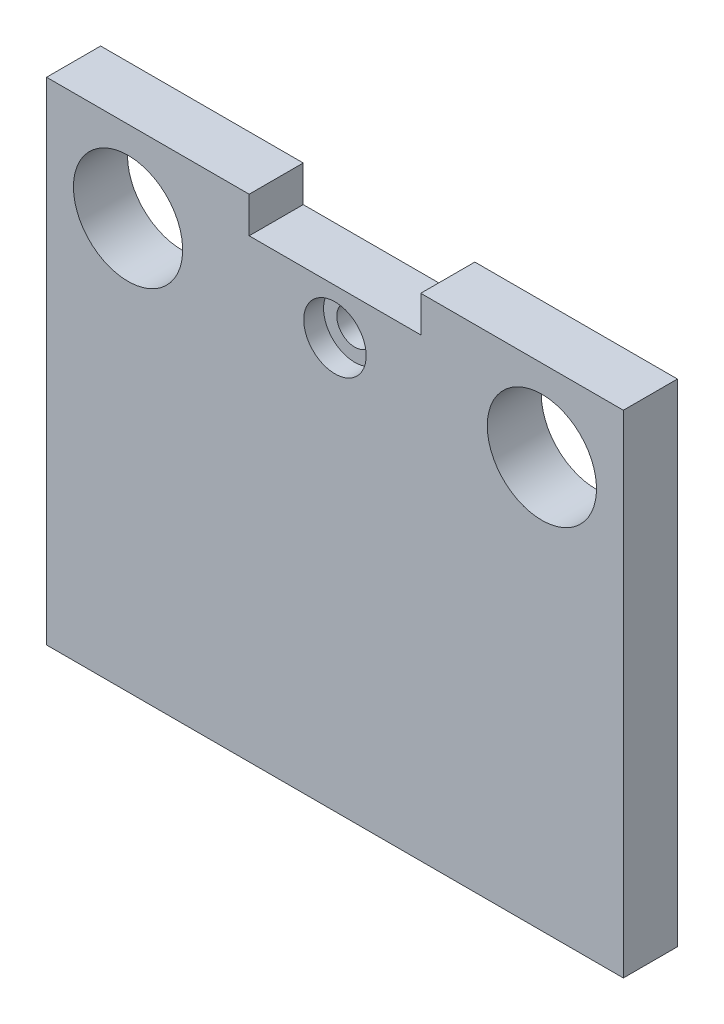
ISO-10303-21;
HEADER;
FILE_DESCRIPTION(('STEP AP214'),'2;1');
FILE_NAME('part.step','',(''),(''),'','','');
FILE_SCHEMA(('AUTOMOTIVE_DESIGN { 1 0 10303 214 1 1 1 1 }'));
ENDSEC;
DATA;
#1=APPLICATION_CONTEXT('core data for automotive mechanical design processes');
#2=APPLICATION_PROTOCOL_DEFINITION('international standard','automotive_design',2000,#1);
#3=PRODUCT_CONTEXT('',#1,'mechanical');
#4=PRODUCT('Part','Part','',(#3));
#5=PRODUCT_RELATED_PRODUCT_CATEGORY('part','',(#4));
#6=PRODUCT_DEFINITION_FORMATION('','',#4);
#7=PRODUCT_DEFINITION_CONTEXT('part definition',#1,'design');
#8=PRODUCT_DEFINITION('design','',#6,#7);
#9=PRODUCT_DEFINITION_SHAPE('','',#8);
#10=(LENGTH_UNIT() NAMED_UNIT(*) SI_UNIT(.MILLI.,.METRE.));
#11=(NAMED_UNIT(*) PLANE_ANGLE_UNIT() SI_UNIT($,.RADIAN.));
#12=(NAMED_UNIT(*) SI_UNIT($,.STERADIAN.) SOLID_ANGLE_UNIT());
#13=UNCERTAINTY_MEASURE_WITH_UNIT(LENGTH_MEASURE(1.E-05),#10,'distance_accuracy_value','');
#14=(GEOMETRIC_REPRESENTATION_CONTEXT(3) GLOBAL_UNCERTAINTY_ASSIGNED_CONTEXT((#13)) GLOBAL_UNIT_ASSIGNED_CONTEXT((#10,
#11,#12)) REPRESENTATION_CONTEXT('',''));
#15=CARTESIAN_POINT('',(0.,0.,0.));
#16=DIRECTION('',(0.,0.,1.));
#17=DIRECTION('',(1.,0.,0.));
#18=AXIS2_PLACEMENT_3D('',#15,#16,#17);
#19=CARTESIAN_POINT('',(203.2,173.228,19.05));
#20=DIRECTION('',(0.,-1.,0.));
#21=DIRECTION('',(0.,0.,-1.));
#22=AXIS2_PLACEMENT_3D('',#19,#20,#21);
#23=PLANE('',#22);
#24=DIRECTION('',(-1.,0.,0.));
#25=VECTOR('',#24,1.);
#26=CARTESIAN_POINT('',(203.2,173.228,0.));
#27=LINE('',#26,#25);
#28=CARTESIAN_POINT('',(203.2,173.228,0.));
#29=VERTEX_POINT('',#28);
#30=CARTESIAN_POINT('',(131.826,173.228,0.));
#31=VERTEX_POINT('',#30);
#32=EDGE_CURVE('E162',#29,#31,#27,.T.);
#33=ORIENTED_EDGE('',*,*,#32,.T.);
#34=DIRECTION('',(0.,0.,-1.));
#35=VECTOR('',#34,1.);
#36=CARTESIAN_POINT('',(131.826,173.228,19.05));
#37=LINE('',#36,#35);
#38=CARTESIAN_POINT('',(131.826,173.228,19.05));
#39=VERTEX_POINT('',#38);
#40=EDGE_CURVE('E130',#39,#31,#37,.T.);
#41=ORIENTED_EDGE('',*,*,#40,.F.);
#42=DIRECTION('',(-1.,0.,0.));
#43=VECTOR('',#42,1.);
#44=CARTESIAN_POINT('',(203.2,173.228,19.05));
#45=LINE('',#44,#43);
#46=CARTESIAN_POINT('',(203.2,173.228,19.05));
#47=VERTEX_POINT('',#46);
#48=EDGE_CURVE('E122',#47,#39,#45,.T.);
#49=ORIENTED_EDGE('',*,*,#48,.F.);
#50=DIRECTION('',(0.,0.,-1.));
#51=VECTOR('',#50,1.);
#52=CARTESIAN_POINT('',(203.2,173.228,19.05));
#53=LINE('',#52,#51);
#54=EDGE_CURVE('E55',#47,#29,#53,.T.);
#55=ORIENTED_EDGE('',*,*,#54,.T.);
#56=EDGE_LOOP('',(#33,#41,#49,#55));
#57=FACE_BOUND('',#56,.T.);
#58=ADVANCED_FACE('F32',(#57),#23,.F.);
#59=CARTESIAN_POINT('',(0.,0.,19.05));
#60=DIRECTION('',(1.,0.,0.));
#61=DIRECTION('',(0.,0.,-1.));
#62=AXIS2_PLACEMENT_3D('',#59,#60,#61);
#63=PLANE('',#62);
#64=DIRECTION('',(0.,-1.,0.));
#65=VECTOR('',#64,1.);
#66=CARTESIAN_POINT('',(0.,0.,19.05));
#67=LINE('',#66,#65);
#68=CARTESIAN_POINT('',(0.,173.228,19.05));
#69=VERTEX_POINT('',#68);
#70=CARTESIAN_POINT('',(0.,0.,19.05));
#71=VERTEX_POINT('',#70);
#72=EDGE_CURVE('E169',#69,#71,#67,.T.);
#73=ORIENTED_EDGE('',*,*,#72,.F.);
#74=DIRECTION('',(0.,0.,-1.));
#75=VECTOR('',#74,1.);
#76=CARTESIAN_POINT('',(0.,173.228,19.05));
#77=LINE('',#76,#75);
#78=CARTESIAN_POINT('',(0.,173.228,0.));
#79=VERTEX_POINT('',#78);
#80=EDGE_CURVE('E164',#69,#79,#77,.T.);
#81=ORIENTED_EDGE('',*,*,#80,.T.);
#82=DIRECTION('',(0.,-1.,0.));
#83=VECTOR('',#82,1.);
#84=CARTESIAN_POINT('',(0.,0.,0.));
#85=LINE('',#84,#83);
#86=CARTESIAN_POINT('',(0.,0.,0.));
#87=VERTEX_POINT('',#86);
#88=EDGE_CURVE('E167',#79,#87,#85,.T.);
#89=ORIENTED_EDGE('',*,*,#88,.T.);
#90=DIRECTION('',(0.,0.,-1.));
#91=VECTOR('',#90,1.);
#92=CARTESIAN_POINT('',(0.,0.,19.05));
#93=LINE('',#92,#91);
#94=EDGE_CURVE('E11',#71,#87,#93,.T.);
#95=ORIENTED_EDGE('',*,*,#94,.F.);
#96=EDGE_LOOP('',(#73,#81,#89,#95));
#97=FACE_BOUND('',#96,.T.);
#98=ADVANCED_FACE('F34',(#97),#63,.F.);
#99=CARTESIAN_POINT('',(0.,0.,19.05));
#100=DIRECTION('',(0.,1.,0.));
#101=DIRECTION('',(0.,0.,1.));
#102=AXIS2_PLACEMENT_3D('',#99,#100,#101);
#103=PLANE('',#102);
#104=DIRECTION('',(1.,0.,0.));
#105=VECTOR('',#104,1.);
#106=CARTESIAN_POINT('',(0.,0.,0.));
#107=LINE('',#106,#105);
#108=CARTESIAN_POINT('',(203.2,0.,0.));
#109=VERTEX_POINT('',#108);
#110=EDGE_CURVE('E177',#87,#109,#107,.T.);
#111=ORIENTED_EDGE('',*,*,#110,.T.);
#112=DIRECTION('',(0.,0.,-1.));
#113=VECTOR('',#112,1.);
#114=CARTESIAN_POINT('',(203.2,0.,19.05));
#115=LINE('',#114,#113);
#116=CARTESIAN_POINT('',(203.2,0.,19.05));
#117=VERTEX_POINT('',#116);
#118=EDGE_CURVE('E40',#117,#109,#115,.T.);
#119=ORIENTED_EDGE('',*,*,#118,.F.);
#120=DIRECTION('',(1.,0.,0.));
#121=VECTOR('',#120,1.);
#122=CARTESIAN_POINT('',(0.,0.,19.05));
#123=LINE('',#122,#121);
#124=EDGE_CURVE('E171',#71,#117,#123,.T.);
#125=ORIENTED_EDGE('',*,*,#124,.F.);
#126=ORIENTED_EDGE('',*,*,#94,.T.);
#127=EDGE_LOOP('',(#111,#119,#125,#126));
#128=FACE_BOUND('',#127,.T.);
#129=ADVANCED_FACE('F195',(#128),#103,.F.);
#130=CARTESIAN_POINT('',(203.2,0.,19.05));
#131=DIRECTION('',(-1.,0.,0.));
#132=DIRECTION('',(0.,0.,1.));
#133=AXIS2_PLACEMENT_3D('',#130,#131,#132);
#134=PLANE('',#133);
#135=DIRECTION('',(0.,1.,0.));
#136=VECTOR('',#135,1.);
#137=CARTESIAN_POINT('',(203.2,0.,0.));
#138=LINE('',#137,#136);
#139=EDGE_CURVE('E172',#109,#29,#138,.T.);
#140=ORIENTED_EDGE('',*,*,#139,.T.);
#141=ORIENTED_EDGE('',*,*,#54,.F.);
#142=DIRECTION('',(0.,1.,0.));
#143=VECTOR('',#142,1.);
#144=CARTESIAN_POINT('',(203.2,0.,19.05));
#145=LINE('',#144,#143);
#146=EDGE_CURVE('E174',#117,#47,#145,.T.);
#147=ORIENTED_EDGE('',*,*,#146,.F.);
#148=ORIENTED_EDGE('',*,*,#118,.T.);
#149=EDGE_LOOP('',(#140,#141,#147,#148));
#150=FACE_BOUND('',#149,.T.);
#151=ADVANCED_FACE('F185',(#150),#134,.F.);
#152=CARTESIAN_POINT('',(0.,304.8,19.05));
#153=DIRECTION('',(0.,0.,-1.));
#154=DIRECTION('',(-1.,0.,0.));
#155=AXIS2_PLACEMENT_3D('',#152,#153,#154);
#156=PLANE('',#155);
#157=ORIENTED_EDGE('',*,*,#48,.T.);
#158=DIRECTION('',(0.,-1.,0.));
#159=VECTOR('',#158,1.);
#160=CARTESIAN_POINT('',(131.826,173.228,19.05));
#161=LINE('',#160,#159);
#162=CARTESIAN_POINT('',(131.826,160.528,19.05));
#163=VERTEX_POINT('',#162);
#164=EDGE_CURVE('E101',#39,#163,#161,.T.);
#165=ORIENTED_EDGE('',*,*,#164,.T.);
#166=DIRECTION('',(-1.,0.,0.));
#167=VECTOR('',#166,1.);
#168=CARTESIAN_POINT('',(131.826,160.528,19.05));
#169=LINE('',#168,#167);
#170=CARTESIAN_POINT('',(71.374,160.528,19.05));
#171=VERTEX_POINT('',#170);
#172=EDGE_CURVE('E112',#163,#171,#169,.T.);
#173=ORIENTED_EDGE('',*,*,#172,.T.);
#174=DIRECTION('',(0.,1.,0.));
#175=VECTOR('',#174,1.);
#176=CARTESIAN_POINT('',(71.374,173.228,19.05));
#177=LINE('',#176,#175);
#178=CARTESIAN_POINT('',(71.374,173.228,19.05));
#179=VERTEX_POINT('',#178);
#180=EDGE_CURVE('E109',#171,#179,#177,.T.);
#181=ORIENTED_EDGE('',*,*,#180,.T.);
#182=EDGE_CURVE('E161',#179,#69,#45,.T.);
#183=ORIENTED_EDGE('',*,*,#182,.T.);
#184=ORIENTED_EDGE('',*,*,#72,.T.);
#185=ORIENTED_EDGE('',*,*,#124,.T.);
#186=ORIENTED_EDGE('',*,*,#146,.T.);
#187=EDGE_LOOP('',(#157,#165,#173,#181,#183,#184,#185,#186));
#188=FACE_BOUND('',#187,.T.);
#189=CARTESIAN_POINT('',(101.6,144.526,19.05));
#190=DIRECTION('',(0.,0.,1.));
#191=DIRECTION('',(1.,0.,0.));
#192=AXIS2_PLACEMENT_3D('',#189,#190,#191);
#193=CIRCLE('',#192,10.9982);
#194=CARTESIAN_POINT('',(112.5982,144.526,19.05));
#195=VERTEX_POINT('',#194);
#196=EDGE_CURVE('E139',#195,#195,#193,.T.);
#197=ORIENTED_EDGE('',*,*,#196,.F.);
#198=EDGE_LOOP('',(#197));
#199=FACE_BOUND('',#198,.T.);
#200=CARTESIAN_POINT('',(28.702,144.526,19.05));
#201=DIRECTION('',(0.,0.,-1.));
#202=DIRECTION('',(-1.,0.,0.));
#203=AXIS2_PLACEMENT_3D('',#200,#201,#202);
#204=CIRCLE('',#203,19.2405);
#205=CARTESIAN_POINT('',(9.4615,144.526,19.05));
#206=VERTEX_POINT('',#205);
#207=EDGE_CURVE('E148',#206,#206,#204,.T.);
#208=ORIENTED_EDGE('',*,*,#207,.T.);
#209=EDGE_LOOP('',(#208));
#210=FACE_BOUND('',#209,.T.);
#211=CARTESIAN_POINT('',(174.498,144.526,19.05));
#212=DIRECTION('',(0.,0.,-1.));
#213=DIRECTION('',(-1.,0.,0.));
#214=AXIS2_PLACEMENT_3D('',#211,#212,#213);
#215=CIRCLE('',#214,19.2405);
#216=CARTESIAN_POINT('',(155.2575,144.526,19.05));
#217=VERTEX_POINT('',#216);
#218=EDGE_CURVE('E154',#217,#217,#215,.T.);
#219=ORIENTED_EDGE('',*,*,#218,.T.);
#220=EDGE_LOOP('',(#219));
#221=FACE_BOUND('',#220,.T.);
#222=ADVANCED_FACE('F119',(#188,#199,#210,#221),#156,.F.);
#223=CARTESIAN_POINT('',(0.,304.8,0.));
#224=DIRECTION('',(0.,0.,-1.));
#225=DIRECTION('',(-1.,0.,0.));
#226=AXIS2_PLACEMENT_3D('',#223,#224,#225);
#227=PLANE('',#226);
#228=DIRECTION('',(0.,-1.,0.));
#229=VECTOR('',#228,1.);
#230=CARTESIAN_POINT('',(131.826,173.228,0.));
#231=LINE('',#230,#229);
#232=CARTESIAN_POINT('',(131.826,160.528,0.));
#233=VERTEX_POINT('',#232);
#234=EDGE_CURVE('E104',#31,#233,#231,.T.);
#235=ORIENTED_EDGE('',*,*,#234,.F.);
#236=ORIENTED_EDGE('',*,*,#32,.F.);
#237=ORIENTED_EDGE('',*,*,#139,.F.);
#238=ORIENTED_EDGE('',*,*,#110,.F.);
#239=ORIENTED_EDGE('',*,*,#88,.F.);
#240=CARTESIAN_POINT('',(71.374,173.228,0.));
#241=VERTEX_POINT('',#240);
#242=EDGE_CURVE('E157',#241,#79,#27,.T.);
#243=ORIENTED_EDGE('',*,*,#242,.F.);
#244=DIRECTION('',(0.,1.,0.));
#245=VECTOR('',#244,1.);
#246=CARTESIAN_POINT('',(71.374,173.228,0.));
#247=LINE('',#246,#245);
#248=CARTESIAN_POINT('',(71.374,160.528,0.));
#249=VERTEX_POINT('',#248);
#250=EDGE_CURVE('E47',#249,#241,#247,.T.);
#251=ORIENTED_EDGE('',*,*,#250,.F.);
#252=DIRECTION('',(-1.,0.,0.));
#253=VECTOR('',#252,1.);
#254=CARTESIAN_POINT('',(131.826,160.528,0.));
#255=LINE('',#254,#253);
#256=EDGE_CURVE('E124',#233,#249,#255,.T.);
#257=ORIENTED_EDGE('',*,*,#256,.F.);
#258=EDGE_LOOP('',(#235,#236,#237,#238,#239,#243,#251,#257));
#259=FACE_BOUND('',#258,.T.);
#260=CARTESIAN_POINT('',(101.6,144.526,0.));
#261=DIRECTION('',(0.,0.,1.));
#262=DIRECTION('',(1.,0.,0.));
#263=AXIS2_PLACEMENT_3D('',#260,#261,#262);
#264=CIRCLE('',#263,6.34999999999999);
#265=CARTESIAN_POINT('',(107.95,144.526,0.));
#266=VERTEX_POINT('',#265);
#267=EDGE_CURVE('E136',#266,#266,#264,.T.);
#268=ORIENTED_EDGE('',*,*,#267,.T.);
#269=EDGE_LOOP('',(#268));
#270=FACE_BOUND('',#269,.T.);
#271=CARTESIAN_POINT('',(28.702,144.526,0.));
#272=DIRECTION('',(0.,0.,-1.));
#273=DIRECTION('',(-1.,0.,0.));
#274=AXIS2_PLACEMENT_3D('',#271,#272,#273);
#275=CIRCLE('',#274,19.2405);
#276=CARTESIAN_POINT('',(9.4615,144.526,0.));
#277=VERTEX_POINT('',#276);
#278=EDGE_CURVE('E145',#277,#277,#275,.T.);
#279=ORIENTED_EDGE('',*,*,#278,.F.);
#280=EDGE_LOOP('',(#279));
#281=FACE_BOUND('',#280,.T.);
#282=CARTESIAN_POINT('',(174.498,144.526,0.));
#283=DIRECTION('',(0.,0.,-1.));
#284=DIRECTION('',(-1.,0.,0.));
#285=AXIS2_PLACEMENT_3D('',#282,#283,#284);
#286=CIRCLE('',#285,19.2405);
#287=CARTESIAN_POINT('',(155.2575,144.526,0.));
#288=VERTEX_POINT('',#287);
#289=EDGE_CURVE('E151',#288,#288,#286,.T.);
#290=ORIENTED_EDGE('',*,*,#289,.F.);
#291=EDGE_LOOP('',(#290));
#292=FACE_BOUND('',#291,.T.);
#293=ADVANCED_FACE('F190',(#259,#270,#281,#292),#227,.T.);
#294=ORIENTED_EDGE('',*,*,#182,.F.);
#295=DIRECTION('',(0.,0.,-1.));
#296=VECTOR('',#295,1.);
#297=CARTESIAN_POINT('',(71.374,173.228,19.05));
#298=LINE('',#297,#296);
#299=EDGE_CURVE('E133',#179,#241,#298,.T.);
#300=ORIENTED_EDGE('',*,*,#299,.T.);
#301=ORIENTED_EDGE('',*,*,#242,.T.);
#302=ORIENTED_EDGE('',*,*,#80,.F.);
#303=EDGE_LOOP('',(#294,#300,#301,#302));
#304=FACE_BOUND('',#303,.T.);
#305=ADVANCED_FACE('F201',(#304),#23,.F.);
#306=CARTESIAN_POINT('',(174.498,144.526,19.05));
#307=DIRECTION('',(0.,0.,-1.));
#308=DIRECTION('',(-1.,0.,0.));
#309=AXIS2_PLACEMENT_3D('',#306,#307,#308);
#310=CYLINDRICAL_SURFACE('',#309,19.2405);
#311=CARTESIAN_POINT('',(155.2575,144.526,19.05));
#312=CARTESIAN_POINT('',(155.2575,144.526,18.8515625));
#313=CARTESIAN_POINT('',(155.2575,144.526,18.653125));
#314=CARTESIAN_POINT('',(155.2575,144.526,18.25625));
#315=CARTESIAN_POINT('',(155.2575,144.526,18.0578125));
#316=CARTESIAN_POINT('',(155.2575,144.526,17.6609375));
#317=CARTESIAN_POINT('',(155.2575,144.526,17.4625));
#318=CARTESIAN_POINT('',(155.2575,144.526,17.065625));
#319=CARTESIAN_POINT('',(155.2575,144.526,16.8671875));
#320=CARTESIAN_POINT('',(155.2575,144.526,16.4703125));
#321=CARTESIAN_POINT('',(155.2575,144.526,16.271875));
#322=CARTESIAN_POINT('',(155.2575,144.526,15.875));
#323=CARTESIAN_POINT('',(155.2575,144.526,15.6765625));
#324=CARTESIAN_POINT('',(155.2575,144.526,15.2796875));
#325=CARTESIAN_POINT('',(155.2575,144.526,15.08125));
#326=CARTESIAN_POINT('',(155.2575,144.526,14.684375));
#327=CARTESIAN_POINT('',(155.2575,144.526,14.4859375));
#328=CARTESIAN_POINT('',(155.2575,144.526,14.0890625));
#329=CARTESIAN_POINT('',(155.2575,144.526,13.890625));
#330=CARTESIAN_POINT('',(155.2575,144.526,13.49375));
#331=CARTESIAN_POINT('',(155.2575,144.526,13.2953125));
#332=CARTESIAN_POINT('',(155.2575,144.526,12.8984375));
#333=CARTESIAN_POINT('',(155.2575,144.526,12.7));
#334=CARTESIAN_POINT('',(155.2575,144.526,12.303125));
#335=CARTESIAN_POINT('',(155.2575,144.526,12.1046875));
#336=CARTESIAN_POINT('',(155.2575,144.526,11.7078125));
#337=CARTESIAN_POINT('',(155.2575,144.526,11.509375));
#338=CARTESIAN_POINT('',(155.2575,144.526,11.1125));
#339=CARTESIAN_POINT('',(155.2575,144.526,10.9140625));
#340=CARTESIAN_POINT('',(155.2575,144.526,10.5171875));
#341=CARTESIAN_POINT('',(155.2575,144.526,10.31875));
#342=CARTESIAN_POINT('',(155.2575,144.526,9.921875));
#343=CARTESIAN_POINT('',(155.2575,144.526,9.7234375));
#344=CARTESIAN_POINT('',(155.2575,144.526,9.3265625));
#345=CARTESIAN_POINT('',(155.2575,144.526,9.128125));
#346=CARTESIAN_POINT('',(155.2575,144.526,8.73125));
#347=CARTESIAN_POINT('',(155.2575,144.526,8.5328125));
#348=CARTESIAN_POINT('',(155.2575,144.526,8.1359375));
#349=CARTESIAN_POINT('',(155.2575,144.526,7.9375));
#350=CARTESIAN_POINT('',(155.2575,144.526,7.540625));
#351=CARTESIAN_POINT('',(155.2575,144.526,7.3421875));
#352=CARTESIAN_POINT('',(155.2575,144.526,6.9453125));
#353=CARTESIAN_POINT('',(155.2575,144.526,6.746875));
#354=CARTESIAN_POINT('',(155.2575,144.526,6.35));
#355=CARTESIAN_POINT('',(155.2575,144.526,6.1515625));
#356=CARTESIAN_POINT('',(155.2575,144.526,5.7546875));
#357=CARTESIAN_POINT('',(155.2575,144.526,5.55625));
#358=CARTESIAN_POINT('',(155.2575,144.526,5.159375));
#359=CARTESIAN_POINT('',(155.2575,144.526,4.9609375));
#360=CARTESIAN_POINT('',(155.2575,144.526,4.5640625));
#361=CARTESIAN_POINT('',(155.2575,144.526,4.365625));
#362=CARTESIAN_POINT('',(155.2575,144.526,3.96875));
#363=CARTESIAN_POINT('',(155.2575,144.526,3.7703125));
#364=CARTESIAN_POINT('',(155.2575,144.526,3.3734375));
#365=CARTESIAN_POINT('',(155.2575,144.526,3.175));
#366=CARTESIAN_POINT('',(155.2575,144.526,2.778125));
#367=CARTESIAN_POINT('',(155.2575,144.526,2.5796875));
#368=CARTESIAN_POINT('',(155.2575,144.526,2.1828125));
#369=CARTESIAN_POINT('',(155.2575,144.526,1.984375));
#370=CARTESIAN_POINT('',(155.2575,144.526,1.5875));
#371=CARTESIAN_POINT('',(155.2575,144.526,1.3890625));
#372=CARTESIAN_POINT('',(155.2575,144.526,0.992187500000001));
#373=CARTESIAN_POINT('',(155.2575,144.526,0.793750000000001));
#374=CARTESIAN_POINT('',(155.2575,144.526,0.396875));
#375=CARTESIAN_POINT('',(155.2575,144.526,0.1984375));
#376=CARTESIAN_POINT('',(155.2575,144.526,0.));
#377=B_SPLINE_CURVE_WITH_KNOTS('',3,(#311,#312,#313,#314,#315,#316,#317,#318,#319,#320,#321,
#322,#323,#324,#325,#326,#327,#328,#329,#330,#331,#332,#333,#334,#335,#336,#337,#338,#339,#340,
#341,#342,#343,#344,#345,#346,#347,#348,#349,#350,#351,#352,#353,#354,#355,#356,#357,#358,#359,
#360,#361,#362,#363,#364,#365,#366,#367,#368,#369,#370,#371,#372,#373,#374,#375,#376),
.UNSPECIFIED.,.F.,.F.,(4,2,2,2,2,2,2,2,2,2,2,2,2,2,2,2,2,2,2,2,2,2,2,2,2,2,2,2,2,2,2,2,4),(0.,
0.595312499999997,1.190625,1.7859375,2.38125,2.9765625,3.571875,4.1671875,4.7625,5.3578125,
5.953125,6.5484375,7.14375,7.7390625,8.334375,8.9296875,9.525,10.1203125,10.715625,11.3109375,
11.90625,12.5015625,13.096875,13.6921875,14.2875,14.8828125,15.478125,16.0734375,16.66875,
17.2640625,17.859375,18.4546875,19.05),.UNSPECIFIED.);
#378=EDGE_CURVE('BSEAM220',#217,#288,#377,.T.);
#379=ORIENTED_EDGE('',*,*,#218,.F.);
#380=ORIENTED_EDGE('',*,*,#289,.T.);
#381=ORIENTED_EDGE('',*,*,#378,.T.);
#382=ORIENTED_EDGE('',*,*,#378,.F.);
#383=EDGE_LOOP('',(#379,#381,#380,#382));
#384=FACE_BOUND('',#383,.T.);
#385=ADVANCED_FACE('F220',(#384),#310,.F.);
#386=CARTESIAN_POINT('',(28.702,144.526,19.05));
#387=DIRECTION('',(0.,0.,-1.));
#388=DIRECTION('',(-1.,0.,0.));
#389=AXIS2_PLACEMENT_3D('',#386,#387,#388);
#390=CYLINDRICAL_SURFACE('',#389,19.2405);
#391=CARTESIAN_POINT('',(9.4615,144.526,19.05));
#392=CARTESIAN_POINT('',(9.4615,144.526,18.8515625));
#393=CARTESIAN_POINT('',(9.4615,144.526,18.653125));
#394=CARTESIAN_POINT('',(9.4615,144.526,18.25625));
#395=CARTESIAN_POINT('',(9.4615,144.526,18.0578125));
#396=CARTESIAN_POINT('',(9.4615,144.526,17.6609375));
#397=CARTESIAN_POINT('',(9.4615,144.526,17.4625));
#398=CARTESIAN_POINT('',(9.4615,144.526,17.065625));
#399=CARTESIAN_POINT('',(9.4615,144.526,16.8671875));
#400=CARTESIAN_POINT('',(9.4615,144.526,16.4703125));
#401=CARTESIAN_POINT('',(9.4615,144.526,16.271875));
#402=CARTESIAN_POINT('',(9.4615,144.526,15.875));
#403=CARTESIAN_POINT('',(9.4615,144.526,15.6765625));
#404=CARTESIAN_POINT('',(9.4615,144.526,15.2796875));
#405=CARTESIAN_POINT('',(9.4615,144.526,15.08125));
#406=CARTESIAN_POINT('',(9.4615,144.526,14.684375));
#407=CARTESIAN_POINT('',(9.4615,144.526,14.4859375));
#408=CARTESIAN_POINT('',(9.4615,144.526,14.0890625));
#409=CARTESIAN_POINT('',(9.4615,144.526,13.890625));
#410=CARTESIAN_POINT('',(9.4615,144.526,13.49375));
#411=CARTESIAN_POINT('',(9.4615,144.526,13.2953125));
#412=CARTESIAN_POINT('',(9.4615,144.526,12.8984375));
#413=CARTESIAN_POINT('',(9.4615,144.526,12.7));
#414=CARTESIAN_POINT('',(9.4615,144.526,12.303125));
#415=CARTESIAN_POINT('',(9.4615,144.526,12.1046875));
#416=CARTESIAN_POINT('',(9.4615,144.526,11.7078125));
#417=CARTESIAN_POINT('',(9.4615,144.526,11.509375));
#418=CARTESIAN_POINT('',(9.4615,144.526,11.1125));
#419=CARTESIAN_POINT('',(9.4615,144.526,10.9140625));
#420=CARTESIAN_POINT('',(9.4615,144.526,10.5171875));
#421=CARTESIAN_POINT('',(9.4615,144.526,10.31875));
#422=CARTESIAN_POINT('',(9.4615,144.526,9.921875));
#423=CARTESIAN_POINT('',(9.4615,144.526,9.7234375));
#424=CARTESIAN_POINT('',(9.4615,144.526,9.3265625));
#425=CARTESIAN_POINT('',(9.4615,144.526,9.128125));
#426=CARTESIAN_POINT('',(9.4615,144.526,8.73125));
#427=CARTESIAN_POINT('',(9.4615,144.526,8.5328125));
#428=CARTESIAN_POINT('',(9.4615,144.526,8.1359375));
#429=CARTESIAN_POINT('',(9.4615,144.526,7.9375));
#430=CARTESIAN_POINT('',(9.4615,144.526,7.540625));
#431=CARTESIAN_POINT('',(9.4615,144.526,7.3421875));
#432=CARTESIAN_POINT('',(9.4615,144.526,6.9453125));
#433=CARTESIAN_POINT('',(9.4615,144.526,6.746875));
#434=CARTESIAN_POINT('',(9.4615,144.526,6.35));
#435=CARTESIAN_POINT('',(9.4615,144.526,6.1515625));
#436=CARTESIAN_POINT('',(9.4615,144.526,5.7546875));
#437=CARTESIAN_POINT('',(9.4615,144.526,5.55625));
#438=CARTESIAN_POINT('',(9.4615,144.526,5.159375));
#439=CARTESIAN_POINT('',(9.4615,144.526,4.9609375));
#440=CARTESIAN_POINT('',(9.4615,144.526,4.5640625));
#441=CARTESIAN_POINT('',(9.4615,144.526,4.365625));
#442=CARTESIAN_POINT('',(9.4615,144.526,3.96875));
#443=CARTESIAN_POINT('',(9.4615,144.526,3.7703125));
#444=CARTESIAN_POINT('',(9.4615,144.526,3.3734375));
#445=CARTESIAN_POINT('',(9.4615,144.526,3.175));
#446=CARTESIAN_POINT('',(9.4615,144.526,2.778125));
#447=CARTESIAN_POINT('',(9.4615,144.526,2.5796875));
#448=CARTESIAN_POINT('',(9.4615,144.526,2.1828125));
#449=CARTESIAN_POINT('',(9.4615,144.526,1.984375));
#450=CARTESIAN_POINT('',(9.4615,144.526,1.5875));
#451=CARTESIAN_POINT('',(9.4615,144.526,1.3890625));
#452=CARTESIAN_POINT('',(9.4615,144.526,0.992187500000001));
#453=CARTESIAN_POINT('',(9.4615,144.526,0.793750000000001));
#454=CARTESIAN_POINT('',(9.4615,144.526,0.396875));
#455=CARTESIAN_POINT('',(9.4615,144.526,0.1984375));
#456=CARTESIAN_POINT('',(9.4615,144.526,0.));
#457=B_SPLINE_CURVE_WITH_KNOTS('',3,(#391,#392,#393,#394,#395,#396,#397,#398,#399,#400,#401,
#402,#403,#404,#405,#406,#407,#408,#409,#410,#411,#412,#413,#414,#415,#416,#417,#418,#419,#420,
#421,#422,#423,#424,#425,#426,#427,#428,#429,#430,#431,#432,#433,#434,#435,#436,#437,#438,#439,
#440,#441,#442,#443,#444,#445,#446,#447,#448,#449,#450,#451,#452,#453,#454,#455,#456),
.UNSPECIFIED.,.F.,.F.,(4,2,2,2,2,2,2,2,2,2,2,2,2,2,2,2,2,2,2,2,2,2,2,2,2,2,2,2,2,2,2,2,4),(0.,
0.595312499999997,1.190625,1.7859375,2.38125,2.9765625,3.571875,4.1671875,4.7625,5.3578125,
5.953125,6.5484375,7.14375,7.7390625,8.334375,8.9296875,9.525,10.1203125,10.715625,11.3109375,
11.90625,12.5015625,13.096875,13.6921875,14.2875,14.8828125,15.478125,16.0734375,16.66875,
17.2640625,17.859375,18.4546875,19.05),.UNSPECIFIED.);
#458=EDGE_CURVE('BSEAM225',#206,#277,#457,.T.);
#459=ORIENTED_EDGE('',*,*,#207,.F.);
#460=ORIENTED_EDGE('',*,*,#278,.T.);
#461=ORIENTED_EDGE('',*,*,#458,.T.);
#462=ORIENTED_EDGE('',*,*,#458,.F.);
#463=EDGE_LOOP('',(#459,#461,#460,#462));
#464=FACE_BOUND('',#463,.T.);
#465=ADVANCED_FACE('F225',(#464),#390,.F.);
#466=CARTESIAN_POINT('',(101.6,144.526,12.065));
#467=DIRECTION('',(0.,0.,1.));
#468=DIRECTION('',(1.,0.,0.));
#469=AXIS2_PLACEMENT_3D('',#466,#467,#468);
#470=CYLINDRICAL_SURFACE('',#469,10.9982);
#471=CARTESIAN_POINT('',(101.6,144.526,12.065));
#472=DIRECTION('',(0.,0.,1.));
#473=DIRECTION('',(1.,0.,0.));
#474=AXIS2_PLACEMENT_3D('',#471,#472,#473);
#475=CIRCLE('',#474,10.9982);
#476=CARTESIAN_POINT('',(112.5982,144.526,12.065));
#477=VERTEX_POINT('',#476);
#478=EDGE_CURVE('E142',#477,#477,#475,.T.);
#479=ORIENTED_EDGE('',*,*,#478,.F.);
#480=EDGE_LOOP('',(#479));
#481=FACE_BOUND('',#480,.T.);
#482=ORIENTED_EDGE('',*,*,#196,.T.);
#483=EDGE_LOOP('',(#482));
#484=FACE_BOUND('',#483,.T.);
#485=ADVANCED_FACE('F290',(#481,#484),#470,.F.);
#486=CARTESIAN_POINT('',(101.6,144.526,12.065));
#487=DIRECTION('',(0.,0.,1.));
#488=DIRECTION('',(1.,0.,0.));
#489=AXIS2_PLACEMENT_3D('',#486,#487,#488);
#490=PLANE('',#489);
#491=CARTESIAN_POINT('',(101.6,144.526,12.065));
#492=DIRECTION('',(0.,0.,1.));
#493=DIRECTION('',(1.,0.,0.));
#494=AXIS2_PLACEMENT_3D('',#491,#492,#493);
#495=CIRCLE('',#494,6.34999999999999);
#496=CARTESIAN_POINT('',(107.95,144.526,12.065));
#497=VERTEX_POINT('',#496);
#498=EDGE_CURVE('E132',#497,#497,#495,.T.);
#499=ORIENTED_EDGE('',*,*,#498,.F.);
#500=EDGE_LOOP('',(#499));
#501=FACE_BOUND('',#500,.T.);
#502=ORIENTED_EDGE('',*,*,#478,.T.);
#503=EDGE_LOOP('',(#502));
#504=FACE_BOUND('',#503,.T.);
#505=ADVANCED_FACE('F282',(#501,#504),#490,.T.);
#506=CARTESIAN_POINT('',(101.6,144.526,0.));
#507=DIRECTION('',(0.,0.,1.));
#508=DIRECTION('',(1.,0.,0.));
#509=AXIS2_PLACEMENT_3D('',#506,#507,#508);
#510=CYLINDRICAL_SURFACE('',#509,6.34999999999999);
#511=CARTESIAN_POINT('',(107.95,144.526,0.));
#512=CARTESIAN_POINT('',(107.95,144.526,0.125677083333333));
#513=CARTESIAN_POINT('',(107.95,144.526,0.251354166666667));
#514=CARTESIAN_POINT('',(107.95,144.526,0.502708333333333));
#515=CARTESIAN_POINT('',(107.95,144.526,0.628385416666666));
#516=CARTESIAN_POINT('',(107.95,144.526,0.879739583333333));
#517=CARTESIAN_POINT('',(107.95,144.526,1.00541666666667));
#518=CARTESIAN_POINT('',(107.95,144.526,1.25677083333333));
#519=CARTESIAN_POINT('',(107.95,144.526,1.38244791666667));
#520=CARTESIAN_POINT('',(107.95,144.526,1.63380208333333));
#521=CARTESIAN_POINT('',(107.95,144.526,1.75947916666667));
#522=CARTESIAN_POINT('',(107.95,144.526,2.01083333333333));
#523=CARTESIAN_POINT('',(107.95,144.526,2.13651041666667));
#524=CARTESIAN_POINT('',(107.95,144.526,2.38786458333333));
#525=CARTESIAN_POINT('',(107.95,144.526,2.51354166666667));
#526=CARTESIAN_POINT('',(107.95,144.526,2.76489583333333));
#527=CARTESIAN_POINT('',(107.95,144.526,2.89057291666667));
#528=CARTESIAN_POINT('',(107.95,144.526,3.14192708333333));
#529=CARTESIAN_POINT('',(107.95,144.526,3.26760416666667));
#530=CARTESIAN_POINT('',(107.95,144.526,3.51895833333333));
#531=CARTESIAN_POINT('',(107.95,144.526,3.64463541666667));
#532=CARTESIAN_POINT('',(107.95,144.526,3.89598958333333));
#533=CARTESIAN_POINT('',(107.95,144.526,4.02166666666667));
#534=CARTESIAN_POINT('',(107.95,144.526,4.27302083333333));
#535=CARTESIAN_POINT('',(107.95,144.526,4.39869791666667));
#536=CARTESIAN_POINT('',(107.95,144.526,4.65005208333333));
#537=CARTESIAN_POINT('',(107.95,144.526,4.77572916666667));
#538=CARTESIAN_POINT('',(107.95,144.526,5.02708333333333));
#539=CARTESIAN_POINT('',(107.95,144.526,5.15276041666667));
#540=CARTESIAN_POINT('',(107.95,144.526,5.40411458333333));
#541=CARTESIAN_POINT('',(107.95,144.526,5.52979166666667));
#542=CARTESIAN_POINT('',(107.95,144.526,5.78114583333333));
#543=CARTESIAN_POINT('',(107.95,144.526,5.90682291666667));
#544=CARTESIAN_POINT('',(107.95,144.526,6.15817708333333));
#545=CARTESIAN_POINT('',(107.95,144.526,6.28385416666667));
#546=CARTESIAN_POINT('',(107.95,144.526,6.53520833333333));
#547=CARTESIAN_POINT('',(107.95,144.526,6.66088541666667));
#548=CARTESIAN_POINT('',(107.95,144.526,6.91223958333333));
#549=CARTESIAN_POINT('',(107.95,144.526,7.03791666666667));
#550=CARTESIAN_POINT('',(107.95,144.526,7.28927083333333));
#551=CARTESIAN_POINT('',(107.95,144.526,7.41494791666666));
#552=CARTESIAN_POINT('',(107.95,144.526,7.66630208333333));
#553=CARTESIAN_POINT('',(107.95,144.526,7.79197916666666));
#554=CARTESIAN_POINT('',(107.95,144.526,8.04333333333333));
#555=CARTESIAN_POINT('',(107.95,144.526,8.16901041666667));
#556=CARTESIAN_POINT('',(107.95,144.526,8.42036458333333));
#557=CARTESIAN_POINT('',(107.95,144.526,8.54604166666667));
#558=CARTESIAN_POINT('',(107.95,144.526,8.79739583333333));
#559=CARTESIAN_POINT('',(107.95,144.526,8.92307291666667));
#560=CARTESIAN_POINT('',(107.95,144.526,9.17442708333333));
#561=CARTESIAN_POINT('',(107.95,144.526,9.30010416666667));
#562=CARTESIAN_POINT('',(107.95,144.526,9.55145833333333));
#563=CARTESIAN_POINT('',(107.95,144.526,9.67713541666667));
#564=CARTESIAN_POINT('',(107.95,144.526,9.92848958333333));
#565=CARTESIAN_POINT('',(107.95,144.526,10.0541666666667));
#566=CARTESIAN_POINT('',(107.95,144.526,10.3055208333333));
#567=CARTESIAN_POINT('',(107.95,144.526,10.4311979166667));
#568=CARTESIAN_POINT('',(107.95,144.526,10.6825520833333));
#569=CARTESIAN_POINT('',(107.95,144.526,10.8082291666667));
#570=CARTESIAN_POINT('',(107.95,144.526,11.0595833333333));
#571=CARTESIAN_POINT('',(107.95,144.526,11.1852604166667));
#572=CARTESIAN_POINT('',(107.95,144.526,11.4366145833333));
#573=CARTESIAN_POINT('',(107.95,144.526,11.5622916666667));
#574=CARTESIAN_POINT('',(107.95,144.526,11.8136458333333));
#575=CARTESIAN_POINT('',(107.95,144.526,11.9393229166667));
#576=CARTESIAN_POINT('',(107.95,144.526,12.065));
#577=B_SPLINE_CURVE_WITH_KNOTS('',3,(#511,#512,#513,#514,#515,#516,#517,#518,#519,#520,#521,
#522,#523,#524,#525,#526,#527,#528,#529,#530,#531,#532,#533,#534,#535,#536,#537,#538,#539,#540,
#541,#542,#543,#544,#545,#546,#547,#548,#549,#550,#551,#552,#553,#554,#555,#556,#557,#558,#559,
#560,#561,#562,#563,#564,#565,#566,#567,#568,#569,#570,#571,#572,#573,#574,#575,#576),
.UNSPECIFIED.,.F.,.F.,(4,2,2,2,2,2,2,2,2,2,2,2,2,2,2,2,2,2,2,2,2,2,2,2,2,2,2,2,2,2,2,2,4),(0.,
0.37703125,0.7540625,1.13109375,1.508125,1.88515625,2.2621875,2.63921875,3.01625,3.39328125,
3.7703125,4.14734375,4.524375,4.90140625,5.2784375,5.65546875,6.0325,6.40953125,6.7865625,
7.16359375,7.540625,7.91765625,8.2946875,8.67171875,9.04875,9.42578125,9.8028125,10.17984375,
10.556875,10.93390625,11.3109375,11.68796875,12.065),.UNSPECIFIED.);
#578=EDGE_CURVE('BSEAM210',#266,#497,#577,.T.);
#579=ORIENTED_EDGE('',*,*,#267,.F.);
#580=ORIENTED_EDGE('',*,*,#498,.T.);
#581=ORIENTED_EDGE('',*,*,#578,.T.);
#582=ORIENTED_EDGE('',*,*,#578,.F.);
#583=EDGE_LOOP('',(#579,#581,#580,#582));
#584=FACE_BOUND('',#583,.T.);
#585=ADVANCED_FACE('F210',(#584),#510,.F.);
#586=CARTESIAN_POINT('',(131.826,173.228,19.05));
#587=DIRECTION('',(1.,0.,0.));
#588=DIRECTION('',(0.,0.,-1.));
#589=AXIS2_PLACEMENT_3D('',#586,#587,#588);
#590=PLANE('',#589);
#591=ORIENTED_EDGE('',*,*,#234,.T.);
#592=DIRECTION('',(0.,0.,-1.));
#593=VECTOR('',#592,1.);
#594=CARTESIAN_POINT('',(131.826,160.528,19.05));
#595=LINE('',#594,#593);
#596=EDGE_CURVE('E97',#163,#233,#595,.T.);
#597=ORIENTED_EDGE('',*,*,#596,.F.);
#598=ORIENTED_EDGE('',*,*,#164,.F.);
#599=ORIENTED_EDGE('',*,*,#40,.T.);
#600=EDGE_LOOP('',(#591,#597,#598,#599));
#601=FACE_BOUND('',#600,.T.);
#602=ADVANCED_FACE('F99',(#601),#590,.F.);
#603=CARTESIAN_POINT('',(71.374,173.228,19.05));
#604=DIRECTION('',(-1.,0.,0.));
#605=DIRECTION('',(0.,0.,1.));
#606=AXIS2_PLACEMENT_3D('',#603,#604,#605);
#607=PLANE('',#606);
#608=ORIENTED_EDGE('',*,*,#250,.T.);
#609=ORIENTED_EDGE('',*,*,#299,.F.);
#610=ORIENTED_EDGE('',*,*,#180,.F.);
#611=DIRECTION('',(0.,0.,-1.));
#612=VECTOR('',#611,1.);
#613=CARTESIAN_POINT('',(71.374,160.528,19.05));
#614=LINE('',#613,#612);
#615=EDGE_CURVE('E108',#171,#249,#614,.T.);
#616=ORIENTED_EDGE('',*,*,#615,.T.);
#617=EDGE_LOOP('',(#608,#609,#610,#616));
#618=FACE_BOUND('',#617,.T.);
#619=ADVANCED_FACE('F202',(#618),#607,.F.);
#620=CARTESIAN_POINT('',(131.826,160.528,19.05));
#621=DIRECTION('',(0.,-1.,0.));
#622=DIRECTION('',(1.,0.,0.));
#623=AXIS2_PLACEMENT_3D('',#620,#621,#622);
#624=PLANE('',#623);
#625=ORIENTED_EDGE('',*,*,#256,.T.);
#626=ORIENTED_EDGE('',*,*,#615,.F.);
#627=ORIENTED_EDGE('',*,*,#172,.F.);
#628=ORIENTED_EDGE('',*,*,#596,.T.);
#629=EDGE_LOOP('',(#625,#626,#627,#628));
#630=FACE_BOUND('',#629,.T.);
#631=ADVANCED_FACE('F113',(#630),#624,.F.);
#632=CLOSED_SHELL('',(#58,#98,#129,#151,#222,#293,#305,#385,#465,#485,#505,#585,#602,#619,#631));
#633=MANIFOLD_SOLID_BREP('B2',#632);
#634=ADVANCED_BREP_SHAPE_REPRESENTATION('',(#18,#633),#14);
#635=SHAPE_DEFINITION_REPRESENTATION(#9,#634);
ENDSEC;
END-ISO-10303-21;
